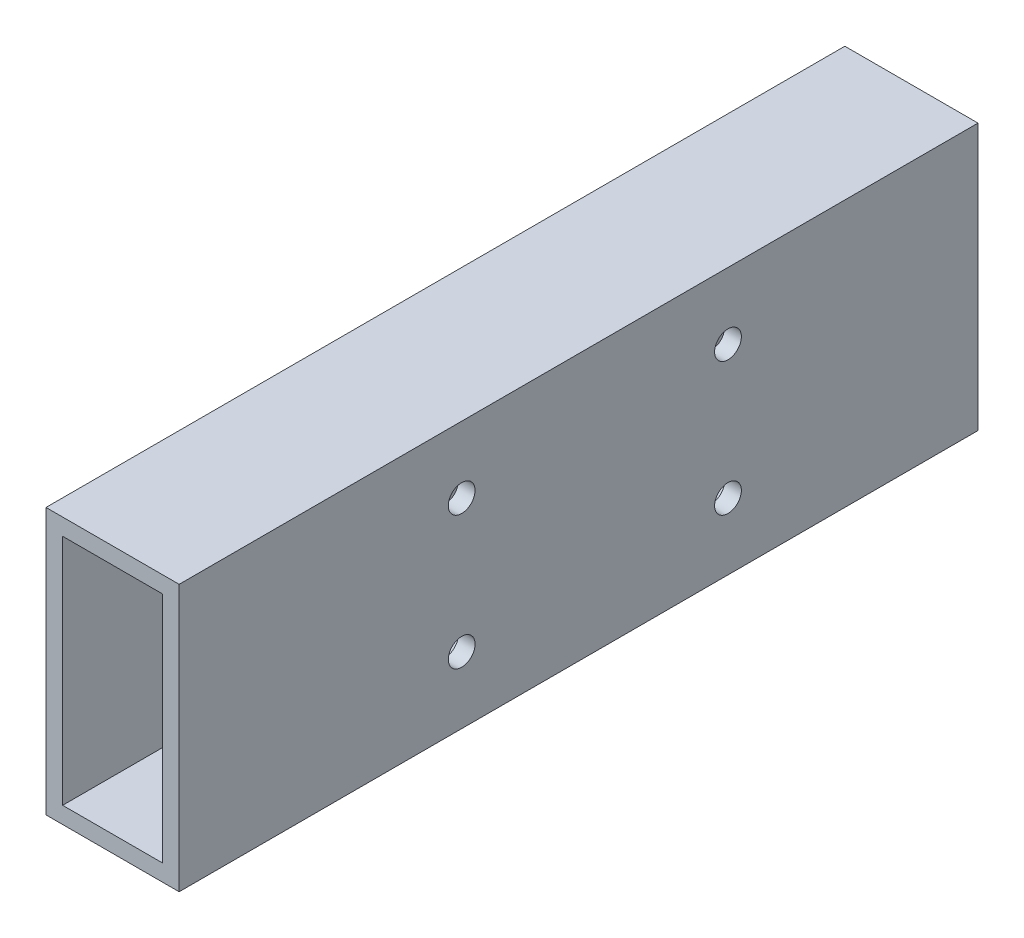
ISO-10303-21;
HEADER;
FILE_DESCRIPTION(('STEP AP214'),'2;1');
FILE_NAME('part.step','',(''),(''),'','','');
FILE_SCHEMA(('AUTOMOTIVE_DESIGN { 1 0 10303 214 1 1 1 1 }'));
ENDSEC;
DATA;
#1=APPLICATION_CONTEXT('core data for automotive mechanical design processes');
#2=APPLICATION_PROTOCOL_DEFINITION('international standard','automotive_design',2000,#1);
#3=PRODUCT_CONTEXT('',#1,'mechanical');
#4=PRODUCT('Part','Part','',(#3));
#5=PRODUCT_RELATED_PRODUCT_CATEGORY('part','',(#4));
#6=PRODUCT_DEFINITION_FORMATION('','',#4);
#7=PRODUCT_DEFINITION_CONTEXT('part definition',#1,'design');
#8=PRODUCT_DEFINITION('design','',#6,#7);
#9=PRODUCT_DEFINITION_SHAPE('','',#8);
#10=(LENGTH_UNIT() NAMED_UNIT(*) SI_UNIT(.MILLI.,.METRE.));
#11=(NAMED_UNIT(*) PLANE_ANGLE_UNIT() SI_UNIT($,.RADIAN.));
#12=(NAMED_UNIT(*) SI_UNIT($,.STERADIAN.) SOLID_ANGLE_UNIT());
#13=UNCERTAINTY_MEASURE_WITH_UNIT(LENGTH_MEASURE(1.E-05),#10,'distance_accuracy_value','');
#14=(GEOMETRIC_REPRESENTATION_CONTEXT(3) GLOBAL_UNCERTAINTY_ASSIGNED_CONTEXT((#13)) GLOBAL_UNIT_ASSIGNED_CONTEXT((#10,
#11,#12)) REPRESENTATION_CONTEXT('',''));
#15=CARTESIAN_POINT('',(0.,0.,0.));
#16=DIRECTION('',(0.,0.,1.));
#17=DIRECTION('',(1.,0.,0.));
#18=AXIS2_PLACEMENT_3D('',#15,#16,#17);
#19=CARTESIAN_POINT('',(0.,0.,76.2));
#20=DIRECTION('',(0.,0.,1.));
#21=DIRECTION('',(1.,0.,0.));
#22=AXIS2_PLACEMENT_3D('',#19,#20,#21);
#23=PLANE('',#22);
#24=DIRECTION('',(0.,1.,0.));
#25=VECTOR('',#24,1.);
#26=CARTESIAN_POINT('',(12.7,25.4,76.2));
#27=LINE('',#26,#25);
#28=CARTESIAN_POINT('',(12.7,-25.4,76.2));
#29=VERTEX_POINT('',#28);
#30=CARTESIAN_POINT('',(12.7,25.4,76.2));
#31=VERTEX_POINT('',#30);
#32=EDGE_CURVE('E138',#29,#31,#27,.T.);
#33=ORIENTED_EDGE('',*,*,#32,.T.);
#34=DIRECTION('',(-1.,0.,0.));
#35=VECTOR('',#34,1.);
#36=CARTESIAN_POINT('',(-12.7,25.4,76.2));
#37=LINE('',#36,#35);
#38=CARTESIAN_POINT('',(-12.7,25.4,76.2));
#39=VERTEX_POINT('',#38);
#40=EDGE_CURVE('E141',#31,#39,#37,.T.);
#41=ORIENTED_EDGE('',*,*,#40,.T.);
#42=DIRECTION('',(0.,-1.,0.));
#43=VECTOR('',#42,1.);
#44=CARTESIAN_POINT('',(-12.7,25.4,76.2));
#45=LINE('',#44,#43);
#46=CARTESIAN_POINT('',(-12.7,-25.4,76.2));
#47=VERTEX_POINT('',#46);
#48=EDGE_CURVE('E144',#39,#47,#45,.T.);
#49=ORIENTED_EDGE('',*,*,#48,.T.);
#50=DIRECTION('',(1.,0.,0.));
#51=VECTOR('',#50,1.);
#52=CARTESIAN_POINT('',(-12.7,-25.4,76.2));
#53=LINE('',#52,#51);
#54=EDGE_CURVE('E146',#47,#29,#53,.T.);
#55=ORIENTED_EDGE('',*,*,#54,.T.);
#56=EDGE_LOOP('',(#33,#41,#49,#55));
#57=FACE_BOUND('',#56,.T.);
#58=DIRECTION('',(1.,0.,0.));
#59=VECTOR('',#58,1.);
#60=CARTESIAN_POINT('',(-9.525,-22.225,76.2));
#61=LINE('',#60,#59);
#62=CARTESIAN_POINT('',(-9.525,-22.225,76.2));
#63=VERTEX_POINT('',#62);
#64=CARTESIAN_POINT('',(9.525,-22.225,76.2));
#65=VERTEX_POINT('',#64);
#66=EDGE_CURVE('E108',#63,#65,#61,.T.);
#67=ORIENTED_EDGE('',*,*,#66,.F.);
#68=DIRECTION('',(0.,-1.,0.));
#69=VECTOR('',#68,1.);
#70=CARTESIAN_POINT('',(-9.525,22.225,76.2));
#71=LINE('',#70,#69);
#72=CARTESIAN_POINT('',(-9.525,22.225,76.2));
#73=VERTEX_POINT('',#72);
#74=EDGE_CURVE('E100',#73,#63,#71,.T.);
#75=ORIENTED_EDGE('',*,*,#74,.F.);
#76=DIRECTION('',(-1.,0.,0.));
#77=VECTOR('',#76,1.);
#78=CARTESIAN_POINT('',(-9.525,22.225,76.2));
#79=LINE('',#78,#77);
#80=CARTESIAN_POINT('',(9.525,22.225,76.2));
#81=VERTEX_POINT('',#80);
#82=EDGE_CURVE('E122',#81,#73,#79,.T.);
#83=ORIENTED_EDGE('',*,*,#82,.F.);
#84=DIRECTION('',(0.,1.,0.));
#85=VECTOR('',#84,1.);
#86=CARTESIAN_POINT('',(9.525,22.225,76.2));
#87=LINE('',#86,#85);
#88=EDGE_CURVE('E120',#65,#81,#87,.T.);
#89=ORIENTED_EDGE('',*,*,#88,.F.);
#90=EDGE_LOOP('',(#67,#75,#83,#89));
#91=FACE_BOUND('',#90,.T.);
#92=ADVANCED_FACE('F33',(#57,#91),#23,.T.);
#93=CARTESIAN_POINT('',(0.,0.,-76.2));
#94=DIRECTION('',(0.,0.,1.));
#95=DIRECTION('',(1.,0.,0.));
#96=AXIS2_PLACEMENT_3D('',#93,#94,#95);
#97=PLANE('',#96);
#98=DIRECTION('',(0.,1.,0.));
#99=VECTOR('',#98,1.);
#100=CARTESIAN_POINT('',(12.7,25.4,-76.2));
#101=LINE('',#100,#99);
#102=CARTESIAN_POINT('',(12.7,-25.4,-76.2));
#103=VERTEX_POINT('',#102);
#104=CARTESIAN_POINT('',(12.7,25.4,-76.2));
#105=VERTEX_POINT('',#104);
#106=EDGE_CURVE('E116',#103,#105,#101,.T.);
#107=ORIENTED_EDGE('',*,*,#106,.F.);
#108=DIRECTION('',(1.,0.,0.));
#109=VECTOR('',#108,1.);
#110=CARTESIAN_POINT('',(-12.7,-25.4,-76.2));
#111=LINE('',#110,#109);
#112=CARTESIAN_POINT('',(-12.7,-25.4,-76.2));
#113=VERTEX_POINT('',#112);
#114=EDGE_CURVE('E142',#113,#103,#111,.T.);
#115=ORIENTED_EDGE('',*,*,#114,.F.);
#116=DIRECTION('',(0.,-1.,0.));
#117=VECTOR('',#116,1.);
#118=CARTESIAN_POINT('',(-12.7,25.4,-76.2));
#119=LINE('',#118,#117);
#120=CARTESIAN_POINT('',(-12.7,25.4,-76.2));
#121=VERTEX_POINT('',#120);
#122=EDGE_CURVE('E153',#121,#113,#119,.T.);
#123=ORIENTED_EDGE('',*,*,#122,.F.);
#124=DIRECTION('',(-1.,0.,0.));
#125=VECTOR('',#124,1.);
#126=CARTESIAN_POINT('',(-12.7,25.4,-76.2));
#127=LINE('',#126,#125);
#128=EDGE_CURVE('E151',#105,#121,#127,.T.);
#129=ORIENTED_EDGE('',*,*,#128,.F.);
#130=EDGE_LOOP('',(#107,#115,#123,#129));
#131=FACE_BOUND('',#130,.T.);
#132=DIRECTION('',(0.,-1.,0.));
#133=VECTOR('',#132,1.);
#134=CARTESIAN_POINT('',(-9.525,22.225,-76.2));
#135=LINE('',#134,#133);
#136=CARTESIAN_POINT('',(-9.525,22.225,-76.2));
#137=VERTEX_POINT('',#136);
#138=CARTESIAN_POINT('',(-9.525,-22.225,-76.2));
#139=VERTEX_POINT('',#138);
#140=EDGE_CURVE('E58',#137,#139,#135,.T.);
#141=ORIENTED_EDGE('',*,*,#140,.T.);
#142=DIRECTION('',(1.,0.,0.));
#143=VECTOR('',#142,1.);
#144=CARTESIAN_POINT('',(-9.525,-22.225,-76.2));
#145=LINE('',#144,#143);
#146=CARTESIAN_POINT('',(9.525,-22.225,-76.2));
#147=VERTEX_POINT('',#146);
#148=EDGE_CURVE('E115',#139,#147,#145,.T.);
#149=ORIENTED_EDGE('',*,*,#148,.T.);
#150=DIRECTION('',(0.,1.,0.));
#151=VECTOR('',#150,1.);
#152=CARTESIAN_POINT('',(9.525,22.225,-76.2));
#153=LINE('',#152,#151);
#154=CARTESIAN_POINT('',(9.525,22.225,-76.2));
#155=VERTEX_POINT('',#154);
#156=EDGE_CURVE('E130',#147,#155,#153,.T.);
#157=ORIENTED_EDGE('',*,*,#156,.T.);
#158=DIRECTION('',(-1.,0.,0.));
#159=VECTOR('',#158,1.);
#160=CARTESIAN_POINT('',(-9.525,22.225,-76.2));
#161=LINE('',#160,#159);
#162=EDGE_CURVE('E109',#155,#137,#161,.T.);
#163=ORIENTED_EDGE('',*,*,#162,.T.);
#164=EDGE_LOOP('',(#141,#149,#157,#163));
#165=FACE_BOUND('',#164,.T.);
#166=ADVANCED_FACE('F223',(#131,#165),#97,.F.);
#167=CARTESIAN_POINT('',(12.7,25.4,76.2));
#168=DIRECTION('',(-1.,0.,0.));
#169=DIRECTION('',(0.,-1.,0.));
#170=AXIS2_PLACEMENT_3D('',#167,#168,#169);
#171=PLANE('',#170);
#172=CARTESIAN_POINT('',(12.7,12.7,22.2987698849767));
#173=DIRECTION('',(1.,0.,0.));
#174=DIRECTION('',(0.,0.,-1.));
#175=AXIS2_PLACEMENT_3D('',#172,#173,#174);
#176=CIRCLE('',#175,2.5527);
#177=CARTESIAN_POINT('',(12.7,12.7,19.7460698849767));
#178=VERTEX_POINT('',#177);
#179=EDGE_CURVE('E292',#178,#178,#176,.T.);
#180=ORIENTED_EDGE('',*,*,#179,.F.);
#181=EDGE_LOOP('',(#180));
#182=FACE_BOUND('',#181,.T.);
#183=CARTESIAN_POINT('',(12.7,12.7,-28.5012301150233));
#184=DIRECTION('',(1.,0.,0.));
#185=DIRECTION('',(0.,0.,-1.));
#186=AXIS2_PLACEMENT_3D('',#183,#184,#185);
#187=CIRCLE('',#186,2.5527);
#188=CARTESIAN_POINT('',(12.7,12.7,-31.0539301150233));
#189=VERTEX_POINT('',#188);
#190=EDGE_CURVE('E177',#189,#189,#187,.T.);
#191=ORIENTED_EDGE('',*,*,#190,.F.);
#192=EDGE_LOOP('',(#191));
#193=FACE_BOUND('',#192,.T.);
#194=CARTESIAN_POINT('',(12.7,-12.7,-28.5012301150233));
#195=DIRECTION('',(1.,0.,0.));
#196=DIRECTION('',(0.,0.,-1.));
#197=AXIS2_PLACEMENT_3D('',#194,#195,#196);
#198=CIRCLE('',#197,2.5527);
#199=CARTESIAN_POINT('',(12.7,-12.7,-31.0539301150233));
#200=VERTEX_POINT('',#199);
#201=EDGE_CURVE('E174',#200,#200,#198,.T.);
#202=ORIENTED_EDGE('',*,*,#201,.F.);
#203=EDGE_LOOP('',(#202));
#204=FACE_BOUND('',#203,.T.);
#205=CARTESIAN_POINT('',(12.7,-12.7,22.2987698849766));
#206=DIRECTION('',(1.,0.,0.));
#207=DIRECTION('',(0.,0.,-1.));
#208=AXIS2_PLACEMENT_3D('',#205,#206,#207);
#209=CIRCLE('',#208,2.5527);
#210=CARTESIAN_POINT('',(12.7,-12.7,19.7460698849766));
#211=VERTEX_POINT('',#210);
#212=EDGE_CURVE('E192',#211,#211,#209,.T.);
#213=ORIENTED_EDGE('',*,*,#212,.F.);
#214=EDGE_LOOP('',(#213));
#215=FACE_BOUND('',#214,.T.);
#216=ORIENTED_EDGE('',*,*,#106,.T.);
#217=DIRECTION('',(0.,0.,-1.));
#218=VECTOR('',#217,1.);
#219=CARTESIAN_POINT('',(12.7,25.4,76.2));
#220=LINE('',#219,#218);
#221=EDGE_CURVE('E11',#31,#105,#220,.T.);
#222=ORIENTED_EDGE('',*,*,#221,.F.);
#223=ORIENTED_EDGE('',*,*,#32,.F.);
#224=DIRECTION('',(0.,0.,-1.));
#225=VECTOR('',#224,1.);
#226=CARTESIAN_POINT('',(12.7,-25.4,76.2));
#227=LINE('',#226,#225);
#228=EDGE_CURVE('E148',#29,#103,#227,.T.);
#229=ORIENTED_EDGE('',*,*,#228,.T.);
#230=EDGE_LOOP('',(#216,#222,#223,#229));
#231=FACE_BOUND('',#230,.T.);
#232=ADVANCED_FACE('F35',(#182,#193,#204,#215,#231),#171,.F.);
#233=CARTESIAN_POINT('',(-12.7,25.4,76.2));
#234=DIRECTION('',(0.,-1.,0.));
#235=DIRECTION('',(1.,0.,0.));
#236=AXIS2_PLACEMENT_3D('',#233,#234,#235);
#237=PLANE('',#236);
#238=ORIENTED_EDGE('',*,*,#128,.T.);
#239=DIRECTION('',(0.,0.,-1.));
#240=VECTOR('',#239,1.);
#241=CARTESIAN_POINT('',(-12.7,25.4,76.2));
#242=LINE('',#241,#240);
#243=EDGE_CURVE('E42',#39,#121,#242,.T.);
#244=ORIENTED_EDGE('',*,*,#243,.F.);
#245=ORIENTED_EDGE('',*,*,#40,.F.);
#246=ORIENTED_EDGE('',*,*,#221,.T.);
#247=EDGE_LOOP('',(#238,#244,#245,#246));
#248=FACE_BOUND('',#247,.T.);
#249=ADVANCED_FACE('F232',(#248),#237,.F.);
#250=CARTESIAN_POINT('',(-12.7,25.4,76.2));
#251=DIRECTION('',(1.,0.,0.));
#252=DIRECTION('',(0.,1.,0.));
#253=AXIS2_PLACEMENT_3D('',#250,#251,#252);
#254=PLANE('',#253);
#255=CARTESIAN_POINT('',(-12.7,12.7,22.2987698849767));
#256=DIRECTION('',(1.,0.,0.));
#257=DIRECTION('',(0.,0.,-1.));
#258=AXIS2_PLACEMENT_3D('',#255,#256,#257);
#259=CIRCLE('',#258,2.5527);
#260=CARTESIAN_POINT('',(-12.7,12.7,19.7460698849767));
#261=VERTEX_POINT('',#260);
#262=EDGE_CURVE('E293',#261,#261,#259,.T.);
#263=ORIENTED_EDGE('',*,*,#262,.T.);
#264=EDGE_LOOP('',(#263));
#265=FACE_BOUND('',#264,.T.);
#266=CARTESIAN_POINT('',(-12.7,12.7,-28.5012301150233));
#267=DIRECTION('',(1.,0.,0.));
#268=DIRECTION('',(0.,0.,-1.));
#269=AXIS2_PLACEMENT_3D('',#266,#267,#268);
#270=CIRCLE('',#269,2.5527);
#271=CARTESIAN_POINT('',(-12.7,12.7,-31.0539301150233));
#272=VERTEX_POINT('',#271);
#273=EDGE_CURVE('E170',#272,#272,#270,.T.);
#274=ORIENTED_EDGE('',*,*,#273,.T.);
#275=EDGE_LOOP('',(#274));
#276=FACE_BOUND('',#275,.T.);
#277=CARTESIAN_POINT('',(-12.7,-12.7,-28.5012301150233));
#278=DIRECTION('',(1.,0.,0.));
#279=DIRECTION('',(0.,0.,-1.));
#280=AXIS2_PLACEMENT_3D('',#277,#278,#279);
#281=CIRCLE('',#280,2.5527);
#282=CARTESIAN_POINT('',(-12.7,-12.7,-31.0539301150233));
#283=VERTEX_POINT('',#282);
#284=EDGE_CURVE('E166',#283,#283,#281,.T.);
#285=ORIENTED_EDGE('',*,*,#284,.T.);
#286=EDGE_LOOP('',(#285));
#287=FACE_BOUND('',#286,.T.);
#288=CARTESIAN_POINT('',(-12.7,-12.7,22.2987698849766));
#289=DIRECTION('',(1.,0.,0.));
#290=DIRECTION('',(0.,0.,-1.));
#291=AXIS2_PLACEMENT_3D('',#288,#289,#290);
#292=CIRCLE('',#291,2.5527);
#293=CARTESIAN_POINT('',(-12.7,-12.7,19.7460698849767));
#294=VERTEX_POINT('',#293);
#295=EDGE_CURVE('E195',#294,#294,#292,.T.);
#296=ORIENTED_EDGE('',*,*,#295,.T.);
#297=EDGE_LOOP('',(#296));
#298=FACE_BOUND('',#297,.T.);
#299=ORIENTED_EDGE('',*,*,#122,.T.);
#300=DIRECTION('',(0.,0.,-1.));
#301=VECTOR('',#300,1.);
#302=CARTESIAN_POINT('',(-12.7,-25.4,76.2));
#303=LINE('',#302,#301);
#304=EDGE_CURVE('E158',#47,#113,#303,.T.);
#305=ORIENTED_EDGE('',*,*,#304,.F.);
#306=ORIENTED_EDGE('',*,*,#48,.F.);
#307=ORIENTED_EDGE('',*,*,#243,.T.);
#308=EDGE_LOOP('',(#299,#305,#306,#307));
#309=FACE_BOUND('',#308,.T.);
#310=ADVANCED_FACE('F216',(#265,#276,#287,#298,#309),#254,.F.);
#311=CARTESIAN_POINT('',(-12.7,-25.4,76.2));
#312=DIRECTION('',(0.,1.,0.));
#313=DIRECTION('',(0.,0.,1.));
#314=AXIS2_PLACEMENT_3D('',#311,#312,#313);
#315=PLANE('',#314);
#316=ORIENTED_EDGE('',*,*,#114,.T.);
#317=ORIENTED_EDGE('',*,*,#228,.F.);
#318=ORIENTED_EDGE('',*,*,#54,.F.);
#319=ORIENTED_EDGE('',*,*,#304,.T.);
#320=EDGE_LOOP('',(#316,#317,#318,#319));
#321=FACE_BOUND('',#320,.T.);
#322=ADVANCED_FACE('F207',(#321),#315,.F.);
#323=CARTESIAN_POINT('',(-9.525,22.225,76.2));
#324=DIRECTION('',(1.,0.,0.));
#325=DIRECTION('',(0.,0.,-1.));
#326=AXIS2_PLACEMENT_3D('',#323,#324,#325);
#327=PLANE('',#326);
#328=CARTESIAN_POINT('',(-9.525,12.7,22.2987698849767));
#329=DIRECTION('',(1.,0.,0.));
#330=DIRECTION('',(0.,0.,-1.));
#331=AXIS2_PLACEMENT_3D('',#328,#329,#330);
#332=CIRCLE('',#331,2.5527);
#333=CARTESIAN_POINT('',(-9.525,12.7,19.7460698849767));
#334=VERTEX_POINT('',#333);
#335=EDGE_CURVE('E182',#334,#334,#332,.T.);
#336=ORIENTED_EDGE('',*,*,#335,.F.);
#337=EDGE_LOOP('',(#336));
#338=FACE_BOUND('',#337,.T.);
#339=CARTESIAN_POINT('',(-9.525,12.7,-28.5012301150233));
#340=DIRECTION('',(1.,0.,0.));
#341=DIRECTION('',(0.,0.,-1.));
#342=AXIS2_PLACEMENT_3D('',#339,#340,#341);
#343=CIRCLE('',#342,2.5527);
#344=CARTESIAN_POINT('',(-9.525,12.7,-31.0539301150233));
#345=VERTEX_POINT('',#344);
#346=EDGE_CURVE('E169',#345,#345,#343,.T.);
#347=ORIENTED_EDGE('',*,*,#346,.F.);
#348=EDGE_LOOP('',(#347));
#349=FACE_BOUND('',#348,.T.);
#350=CARTESIAN_POINT('',(-9.525,-12.7,-28.5012301150233));
#351=DIRECTION('',(1.,0.,0.));
#352=DIRECTION('',(0.,0.,-1.));
#353=AXIS2_PLACEMENT_3D('',#350,#351,#352);
#354=CIRCLE('',#353,2.5527);
#355=CARTESIAN_POINT('',(-9.525,-12.7,-31.0539301150233));
#356=VERTEX_POINT('',#355);
#357=EDGE_CURVE('E165',#356,#356,#354,.T.);
#358=ORIENTED_EDGE('',*,*,#357,.F.);
#359=EDGE_LOOP('',(#358));
#360=FACE_BOUND('',#359,.T.);
#361=CARTESIAN_POINT('',(-9.525,-12.7,22.2987698849766));
#362=DIRECTION('',(1.,0.,0.));
#363=DIRECTION('',(0.,0.,-1.));
#364=AXIS2_PLACEMENT_3D('',#361,#362,#363);
#365=CIRCLE('',#364,2.5527);
#366=CARTESIAN_POINT('',(-9.525,-12.7,19.7460698849766));
#367=VERTEX_POINT('',#366);
#368=EDGE_CURVE('E128',#367,#367,#365,.T.);
#369=ORIENTED_EDGE('',*,*,#368,.F.);
#370=EDGE_LOOP('',(#369));
#371=FACE_BOUND('',#370,.T.);
#372=ORIENTED_EDGE('',*,*,#140,.F.);
#373=DIRECTION('',(0.,0.,-1.));
#374=VECTOR('',#373,1.);
#375=CARTESIAN_POINT('',(-9.525,22.225,76.2));
#376=LINE('',#375,#374);
#377=EDGE_CURVE('E104',#73,#137,#376,.T.);
#378=ORIENTED_EDGE('',*,*,#377,.F.);
#379=ORIENTED_EDGE('',*,*,#74,.T.);
#380=DIRECTION('',(0.,0.,-1.));
#381=VECTOR('',#380,1.);
#382=CARTESIAN_POINT('',(-9.525,-22.225,76.2));
#383=LINE('',#382,#381);
#384=EDGE_CURVE('E103',#63,#139,#383,.T.);
#385=ORIENTED_EDGE('',*,*,#384,.T.);
#386=EDGE_LOOP('',(#372,#378,#379,#385));
#387=FACE_BOUND('',#386,.T.);
#388=ADVANCED_FACE('F102',(#338,#349,#360,#371,#387),#327,.T.);
#389=CARTESIAN_POINT('',(-9.525,-22.225,76.2));
#390=DIRECTION('',(0.,1.,0.));
#391=DIRECTION('',(-1.,0.,0.));
#392=AXIS2_PLACEMENT_3D('',#389,#390,#391);
#393=PLANE('',#392);
#394=ORIENTED_EDGE('',*,*,#148,.F.);
#395=ORIENTED_EDGE('',*,*,#384,.F.);
#396=ORIENTED_EDGE('',*,*,#66,.T.);
#397=DIRECTION('',(0.,0.,-1.));
#398=VECTOR('',#397,1.);
#399=CARTESIAN_POINT('',(9.525,-22.225,76.2));
#400=LINE('',#399,#398);
#401=EDGE_CURVE('E117',#65,#147,#400,.T.);
#402=ORIENTED_EDGE('',*,*,#401,.T.);
#403=EDGE_LOOP('',(#394,#395,#396,#402));
#404=FACE_BOUND('',#403,.T.);
#405=ADVANCED_FACE('F112',(#404),#393,.T.);
#406=CARTESIAN_POINT('',(9.525,22.225,76.2));
#407=DIRECTION('',(-1.,0.,0.));
#408=DIRECTION('',(0.,0.,1.));
#409=AXIS2_PLACEMENT_3D('',#406,#407,#408);
#410=PLANE('',#409);
#411=CARTESIAN_POINT('',(9.525,12.7,22.2987698849767));
#412=DIRECTION('',(-1.,0.,0.));
#413=DIRECTION('',(0.,0.,1.));
#414=AXIS2_PLACEMENT_3D('',#411,#412,#413);
#415=CIRCLE('',#414,2.5527);
#416=CARTESIAN_POINT('',(9.525,12.7,24.8514698849766));
#417=VERTEX_POINT('',#416);
#418=EDGE_CURVE('E37',#417,#417,#415,.T.);
#419=ORIENTED_EDGE('',*,*,#418,.F.);
#420=EDGE_LOOP('',(#419));
#421=FACE_BOUND('',#420,.T.);
#422=CARTESIAN_POINT('',(9.525,12.7,-28.5012301150233));
#423=DIRECTION('',(-1.,0.,0.));
#424=DIRECTION('',(0.,0.,1.));
#425=AXIS2_PLACEMENT_3D('',#422,#423,#424);
#426=CIRCLE('',#425,2.5527);
#427=CARTESIAN_POINT('',(9.525,12.7,-25.9485301150233));
#428=VERTEX_POINT('',#427);
#429=EDGE_CURVE('E167',#428,#428,#426,.T.);
#430=ORIENTED_EDGE('',*,*,#429,.F.);
#431=EDGE_LOOP('',(#430));
#432=FACE_BOUND('',#431,.T.);
#433=CARTESIAN_POINT('',(9.525,-12.7,-28.5012301150233));
#434=DIRECTION('',(-1.,0.,0.));
#435=DIRECTION('',(0.,0.,1.));
#436=AXIS2_PLACEMENT_3D('',#433,#434,#435);
#437=CIRCLE('',#436,2.5527);
#438=CARTESIAN_POINT('',(9.525,-12.7,-25.9485301150233));
#439=VERTEX_POINT('',#438);
#440=EDGE_CURVE('E163',#439,#439,#437,.T.);
#441=ORIENTED_EDGE('',*,*,#440,.F.);
#442=EDGE_LOOP('',(#441));
#443=FACE_BOUND('',#442,.T.);
#444=CARTESIAN_POINT('',(9.525,-12.7,22.2987698849766));
#445=DIRECTION('',(-1.,0.,0.));
#446=DIRECTION('',(0.,0.,1.));
#447=AXIS2_PLACEMENT_3D('',#444,#445,#446);
#448=CIRCLE('',#447,2.5527);
#449=CARTESIAN_POINT('',(9.525,-12.7,24.8514698849766));
#450=VERTEX_POINT('',#449);
#451=EDGE_CURVE('E198',#450,#450,#448,.T.);
#452=ORIENTED_EDGE('',*,*,#451,.F.);
#453=EDGE_LOOP('',(#452));
#454=FACE_BOUND('',#453,.T.);
#455=ORIENTED_EDGE('',*,*,#156,.F.);
#456=ORIENTED_EDGE('',*,*,#401,.F.);
#457=ORIENTED_EDGE('',*,*,#88,.T.);
#458=DIRECTION('',(0.,0.,-1.));
#459=VECTOR('',#458,1.);
#460=CARTESIAN_POINT('',(9.525,22.225,76.2));
#461=LINE('',#460,#459);
#462=EDGE_CURVE('E50',#81,#155,#461,.T.);
#463=ORIENTED_EDGE('',*,*,#462,.T.);
#464=EDGE_LOOP('',(#455,#456,#457,#463));
#465=FACE_BOUND('',#464,.T.);
#466=ADVANCED_FACE('F214',(#421,#432,#443,#454,#465),#410,.T.);
#467=CARTESIAN_POINT('',(-9.525,22.225,76.2));
#468=DIRECTION('',(0.,-1.,0.));
#469=DIRECTION('',(0.,0.,-1.));
#470=AXIS2_PLACEMENT_3D('',#467,#468,#469);
#471=PLANE('',#470);
#472=ORIENTED_EDGE('',*,*,#162,.F.);
#473=ORIENTED_EDGE('',*,*,#462,.F.);
#474=ORIENTED_EDGE('',*,*,#82,.T.);
#475=ORIENTED_EDGE('',*,*,#377,.T.);
#476=EDGE_LOOP('',(#472,#473,#474,#475));
#477=FACE_BOUND('',#476,.T.);
#478=ADVANCED_FACE('F254',(#477),#471,.T.);
#479=CARTESIAN_POINT('',(12.7,-12.7,22.2987698849766));
#480=DIRECTION('',(1.,0.,0.));
#481=DIRECTION('',(0.,0.,-1.));
#482=AXIS2_PLACEMENT_3D('',#479,#480,#481);
#483=CYLINDRICAL_SURFACE('',#482,2.5527);
#484=ORIENTED_EDGE('',*,*,#368,.T.);
#485=EDGE_LOOP('',(#484));
#486=FACE_BOUND('',#485,.T.);
#487=ORIENTED_EDGE('',*,*,#295,.F.);
#488=EDGE_LOOP('',(#487));
#489=FACE_BOUND('',#488,.T.);
#490=ADVANCED_FACE('F203',(#486,#489),#483,.F.);
#491=ORIENTED_EDGE('',*,*,#451,.T.);
#492=EDGE_LOOP('',(#491));
#493=FACE_BOUND('',#492,.T.);
#494=ORIENTED_EDGE('',*,*,#212,.T.);
#495=EDGE_LOOP('',(#494));
#496=FACE_BOUND('',#495,.T.);
#497=ADVANCED_FACE('F261',(#493,#496),#483,.F.);
#498=CARTESIAN_POINT('',(12.7,-12.7,-28.5012301150233));
#499=DIRECTION('',(1.,0.,0.));
#500=DIRECTION('',(0.,0.,-1.));
#501=AXIS2_PLACEMENT_3D('',#498,#499,#500);
#502=CYLINDRICAL_SURFACE('',#501,2.5527);
#503=ORIENTED_EDGE('',*,*,#440,.T.);
#504=EDGE_LOOP('',(#503));
#505=FACE_BOUND('',#504,.T.);
#506=ORIENTED_EDGE('',*,*,#201,.T.);
#507=EDGE_LOOP('',(#506));
#508=FACE_BOUND('',#507,.T.);
#509=ADVANCED_FACE('F267',(#505,#508),#502,.F.);
#510=ORIENTED_EDGE('',*,*,#357,.T.);
#511=EDGE_LOOP('',(#510));
#512=FACE_BOUND('',#511,.T.);
#513=ORIENTED_EDGE('',*,*,#284,.F.);
#514=EDGE_LOOP('',(#513));
#515=FACE_BOUND('',#514,.T.);
#516=ADVANCED_FACE('F271',(#512,#515),#502,.F.);
#517=CARTESIAN_POINT('',(12.7,12.7,-28.5012301150233));
#518=DIRECTION('',(1.,0.,0.));
#519=DIRECTION('',(0.,0.,-1.));
#520=AXIS2_PLACEMENT_3D('',#517,#518,#519);
#521=CYLINDRICAL_SURFACE('',#520,2.5527);
#522=ORIENTED_EDGE('',*,*,#429,.T.);
#523=EDGE_LOOP('',(#522));
#524=FACE_BOUND('',#523,.T.);
#525=ORIENTED_EDGE('',*,*,#190,.T.);
#526=EDGE_LOOP('',(#525));
#527=FACE_BOUND('',#526,.T.);
#528=ADVANCED_FACE('F273',(#524,#527),#521,.F.);
#529=ORIENTED_EDGE('',*,*,#346,.T.);
#530=EDGE_LOOP('',(#529));
#531=FACE_BOUND('',#530,.T.);
#532=ORIENTED_EDGE('',*,*,#273,.F.);
#533=EDGE_LOOP('',(#532));
#534=FACE_BOUND('',#533,.T.);
#535=ADVANCED_FACE('F276',(#531,#534),#521,.F.);
#536=CARTESIAN_POINT('',(12.7,12.7,22.2987698849767));
#537=DIRECTION('',(1.,0.,0.));
#538=DIRECTION('',(0.,0.,-1.));
#539=AXIS2_PLACEMENT_3D('',#536,#537,#538);
#540=CYLINDRICAL_SURFACE('',#539,2.5527);
#541=ORIENTED_EDGE('',*,*,#418,.T.);
#542=EDGE_LOOP('',(#541));
#543=FACE_BOUND('',#542,.T.);
#544=ORIENTED_EDGE('',*,*,#179,.T.);
#545=EDGE_LOOP('',(#544));
#546=FACE_BOUND('',#545,.T.);
#547=ADVANCED_FACE('F277',(#543,#546),#540,.F.);
#548=ORIENTED_EDGE('',*,*,#335,.T.);
#549=EDGE_LOOP('',(#548));
#550=FACE_BOUND('',#549,.T.);
#551=ORIENTED_EDGE('',*,*,#262,.F.);
#552=EDGE_LOOP('',(#551));
#553=FACE_BOUND('',#552,.T.);
#554=ADVANCED_FACE('F279',(#550,#553),#540,.F.);
#555=CLOSED_SHELL('',(#92,#166,#232,#249,#310,#322,#388,#405,#466,#478,#490,#497,#509,#516,#528,
#535,#547,#554));
#556=MANIFOLD_SOLID_BREP('B2',#555);
#557=ADVANCED_BREP_SHAPE_REPRESENTATION('',(#18,#556),#14);
#558=SHAPE_DEFINITION_REPRESENTATION(#9,#557);
ENDSEC;
END-ISO-10303-21;
